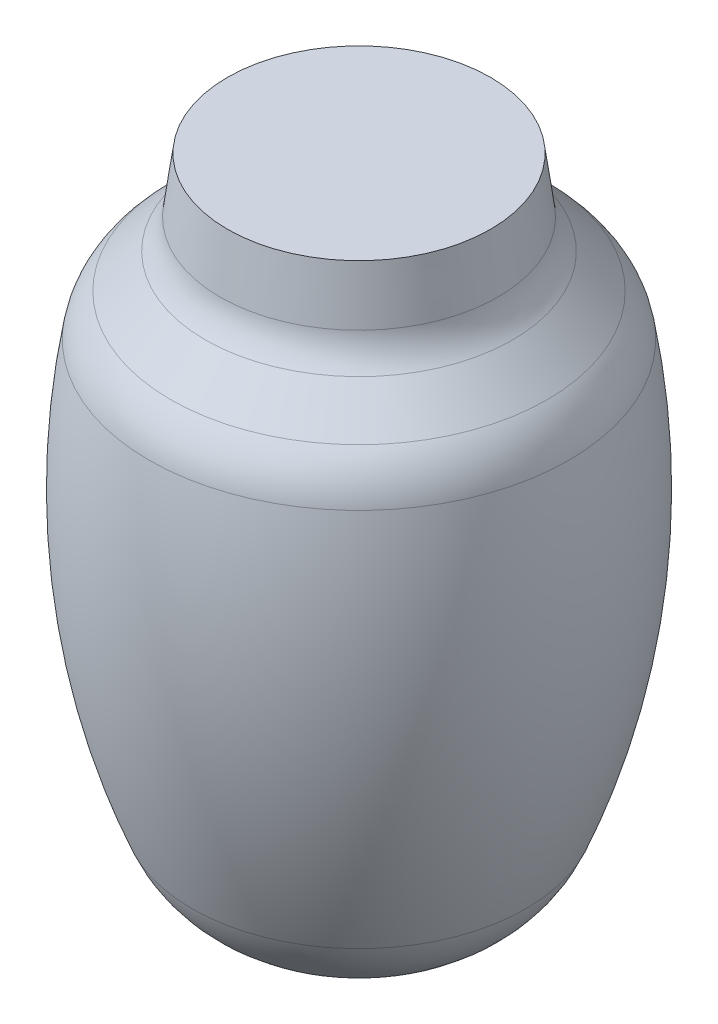
ISO-10303-21;
HEADER;
FILE_DESCRIPTION(('STEP AP214'),'2;1');
FILE_NAME('part.step','',(''),(''),'','','');
FILE_SCHEMA(('AUTOMOTIVE_DESIGN { 1 0 10303 214 1 1 1 1 }'));
ENDSEC;
DATA;
#1=APPLICATION_CONTEXT('core data for automotive mechanical design processes');
#2=APPLICATION_PROTOCOL_DEFINITION('international standard','automotive_design',2000,#1);
#3=PRODUCT_CONTEXT('',#1,'mechanical');
#4=PRODUCT('Part','Part','',(#3));
#5=PRODUCT_RELATED_PRODUCT_CATEGORY('part','',(#4));
#6=PRODUCT_DEFINITION_FORMATION('','',#4);
#7=PRODUCT_DEFINITION_CONTEXT('part definition',#1,'design');
#8=PRODUCT_DEFINITION('design','',#6,#7);
#9=PRODUCT_DEFINITION_SHAPE('','',#8);
#10=(LENGTH_UNIT() NAMED_UNIT(*) SI_UNIT(.MILLI.,.METRE.));
#11=(NAMED_UNIT(*) PLANE_ANGLE_UNIT() SI_UNIT($,.RADIAN.));
#12=(NAMED_UNIT(*) SI_UNIT($,.STERADIAN.) SOLID_ANGLE_UNIT());
#13=UNCERTAINTY_MEASURE_WITH_UNIT(LENGTH_MEASURE(1.E-05),#10,'distance_accuracy_value','');
#14=(GEOMETRIC_REPRESENTATION_CONTEXT(3) GLOBAL_UNCERTAINTY_ASSIGNED_CONTEXT((#13)) GLOBAL_UNIT_ASSIGNED_CONTEXT((#10,
#11,#12)) REPRESENTATION_CONTEXT('',''));
#15=CARTESIAN_POINT('',(0.,0.,0.));
#16=DIRECTION('',(0.,0.,1.));
#17=DIRECTION('',(1.,0.,0.));
#18=AXIS2_PLACEMENT_3D('',#15,#16,#17);
#19=CARTESIAN_POINT('',(481.719516665604,303.299031760844,0.));
#20=DIRECTION('',(0.,1.,0.));
#21=DIRECTION('',(0.,0.,1.));
#22=AXIS2_PLACEMENT_3D('',#19,#20,#21);
#23=DEGENERATE_TOROIDAL_SURFACE('',#22,130.605556352049,184.772032849957,.F.);
#24=CARTESIAN_POINT('',(481.719516665604,335.020947926108,0.));
#25=DIRECTION('',(0.,1.,0.));
#26=DIRECTION('',(0.,0.,1.));
#27=AXIS2_PLACEMENT_3D('',#24,#25,#26);
#28=CIRCLE('',#27,51.4230791927731);
#29=CARTESIAN_POINT('',(481.719516665604,335.020947926108,51.4230791927731));
#30=VERTEX_POINT('',#29);
#31=EDGE_CURVE('E54',#30,#30,#28,.T.);
#32=ORIENTED_EDGE('',*,*,#31,.F.);
#33=EDGE_LOOP('',(#32));
#34=FACE_BOUND('',#33,.T.);
#35=CARTESIAN_POINT('',(481.719516665604,234.587608086372,0.));
#36=DIRECTION('',(0.,1.,0.));
#37=DIRECTION('',(0.,0.,1.));
#38=AXIS2_PLACEMENT_3D('',#35,#36,#37);
#39=CIRCLE('',#38,40.9154172346615);
#40=CARTESIAN_POINT('',(481.719516665604,234.587608086372,40.9154172346615));
#41=VERTEX_POINT('',#40);
#42=EDGE_CURVE('E10',#41,#41,#39,.T.);
#43=ORIENTED_EDGE('',*,*,#42,.T.);
#44=EDGE_LOOP('',(#43));
#45=FACE_BOUND('',#44,.T.);
#46=ADVANCED_FACE('F29',(#34,#45),#23,.F.);
#47=CARTESIAN_POINT('',(481.719516665604,246.394523169869,0.));
#48=DIRECTION('',(0.,1.,0.));
#49=DIRECTION('',(0.,0.,1.));
#50=AXIS2_PLACEMENT_3D('',#47,#48,#49);
#51=DEGENERATE_TOROIDAL_SURFACE('',#50,11.4423913260259,31.75,.T.);
#52=ORIENTED_EDGE('',*,*,#42,.F.);
#53=EDGE_LOOP('',(#52));
#54=FACE_BOUND('',#53,.T.);
#55=CARTESIAN_POINT('',(481.719516665604,214.644523169869,0.));
#56=DIRECTION('',(0.,1.,0.));
#57=DIRECTION('',(0.,0.,1.));
#58=AXIS2_PLACEMENT_3D('',#55,#56,#57);
#59=CIRCLE('',#58,11.4423913260259);
#60=CARTESIAN_POINT('',(481.719516665604,214.644523169869,11.4423913260259));
#61=VERTEX_POINT('',#60);
#62=EDGE_CURVE('E35',#61,#61,#59,.T.);
#63=ORIENTED_EDGE('',*,*,#62,.T.);
#64=EDGE_LOOP('',(#63));
#65=FACE_BOUND('',#64,.T.);
#66=ADVANCED_FACE('F61',(#54,#65),#51,.T.);
#67=CARTESIAN_POINT('',(493.16190799163,214.644523169869,0.));
#68=DIRECTION('',(0.,1.,0.));
#69=DIRECTION('',(0.,0.,1.));
#70=AXIS2_PLACEMENT_3D('',#67,#68,#69);
#71=PLANE('',#70);
#72=ORIENTED_EDGE('',*,*,#62,.F.);
#73=EDGE_LOOP('',(#72));
#74=FACE_BOUND('',#73,.T.);
#75=ADVANCED_FACE('F65',(#74),#71,.F.);
#76=CARTESIAN_POINT('',(513.963655089514,374.45623267277,0.));
#77=DIRECTION('',(0.,-1.,0.));
#78=DIRECTION('',(0.,0.,-1.));
#79=AXIS2_PLACEMENT_3D('',#76,#77,#78);
#80=PLANE('',#79);
#81=CARTESIAN_POINT('',(481.719516665604,374.45623267277,0.));
#82=DIRECTION('',(0.,1.,0.));
#83=DIRECTION('',(0.,0.,1.));
#84=AXIS2_PLACEMENT_3D('',#81,#82,#83);
#85=CIRCLE('',#84,32.2441384239096);
#86=CARTESIAN_POINT('',(481.719516665604,374.45623267277,32.2441384239096));
#87=VERTEX_POINT('',#86);
#88=EDGE_CURVE('E39',#87,#87,#85,.T.);
#89=ORIENTED_EDGE('',*,*,#88,.T.);
#90=EDGE_LOOP('',(#89));
#91=FACE_BOUND('',#90,.T.);
#92=ADVANCED_FACE('F70',(#91),#80,.F.);
#93=CARTESIAN_POINT('',(481.719516665604,360.972346165505,0.));
#94=DIRECTION('',(0.,-1.,0.));
#95=DIRECTION('',(0.,0.,-1.));
#96=AXIS2_PLACEMENT_3D('',#93,#94,#95);
#97=CONICAL_SURFACE('',#96,34.0565983585995,0.133615853739486);
#98=ORIENTED_EDGE('',*,*,#88,.F.);
#99=EDGE_LOOP('',(#98));
#100=FACE_BOUND('',#99,.T.);
#101=CARTESIAN_POINT('',(481.719516665604,360.972346165505,0.));
#102=DIRECTION('',(0.,1.,0.));
#103=DIRECTION('',(0.,0.,1.));
#104=AXIS2_PLACEMENT_3D('',#101,#102,#103);
#105=CIRCLE('',#104,34.0565983585995);
#106=CARTESIAN_POINT('',(481.719516665604,360.972346165505,34.0565983585995));
#107=VERTEX_POINT('',#106);
#108=EDGE_CURVE('E43',#107,#107,#105,.T.);
#109=ORIENTED_EDGE('',*,*,#108,.T.);
#110=EDGE_LOOP('',(#109));
#111=FACE_BOUND('',#110,.T.);
#112=ADVANCED_FACE('F76',(#100,#111),#97,.T.);
#113=CARTESIAN_POINT('',(481.719516665604,362.664222768347,0.));
#114=DIRECTION('',(0.,1.,0.));
#115=DIRECTION('',(0.,0.,1.));
#116=AXIS2_PLACEMENT_3D('',#113,#114,#115);
#117=TOROIDAL_SURFACE('',#116,46.6433991261002,12.6999999999999);
#118=ORIENTED_EDGE('',*,*,#108,.F.);
#119=EDGE_LOOP('',(#118));
#120=FACE_BOUND('',#119,.T.);
#121=CARTESIAN_POINT('',(481.719516665604,353.683966647278,0.));
#122=DIRECTION('',(0.,1.,0.));
#123=DIRECTION('',(0.,0.,1.));
#124=AXIS2_PLACEMENT_3D('',#121,#122,#123);
#125=CIRCLE('',#124,37.6631430050312);
#126=CARTESIAN_POINT('',(481.719516665604,353.683966647278,37.6631430050312));
#127=VERTEX_POINT('',#126);
#128=EDGE_CURVE('E48',#127,#127,#125,.T.);
#129=ORIENTED_EDGE('',*,*,#128,.T.);
#130=EDGE_LOOP('',(#129));
#131=FACE_BOUND('',#130,.T.);
#132=ADVANCED_FACE('F80',(#120,#131),#117,.F.);
#133=CARTESIAN_POINT('',(481.719516665604,345.220801965095,0.));
#134=DIRECTION('',(0.,-1.,0.));
#135=DIRECTION('',(0.,0.,-1.));
#136=AXIS2_PLACEMENT_3D('',#133,#134,#135);
#137=CONICAL_SURFACE('',#136,46.1263076872133,0.785398163397435);
#138=ORIENTED_EDGE('',*,*,#128,.F.);
#139=EDGE_LOOP('',(#138));
#140=FACE_BOUND('',#139,.T.);
#141=CARTESIAN_POINT('',(481.719516665604,345.220801965095,0.));
#142=DIRECTION('',(0.,1.,0.));
#143=DIRECTION('',(0.,0.,1.));
#144=AXIS2_PLACEMENT_3D('',#141,#142,#143);
#145=CIRCLE('',#144,46.1263076872133);
#146=CARTESIAN_POINT('',(481.719516665604,345.220801965095,46.1263076872133));
#147=VERTEX_POINT('',#146);
#148=EDGE_CURVE('E51',#147,#147,#145,.T.);
#149=ORIENTED_EDGE('',*,*,#148,.T.);
#150=EDGE_LOOP('',(#149));
#151=FACE_BOUND('',#150,.T.);
#152=ADVANCED_FACE('F84',(#140,#151),#137,.T.);
#153=CARTESIAN_POINT('',(481.719516665604,331.750417783491,0.));
#154=DIRECTION('',(0.,1.,0.));
#155=DIRECTION('',(0.,0.,1.));
#156=AXIS2_PLACEMENT_3D('',#153,#154,#155);
#157=TOROIDAL_SURFACE('',#156,32.6559235056095,19.05);
#158=ORIENTED_EDGE('',*,*,#148,.F.);
#159=EDGE_LOOP('',(#158));
#160=FACE_BOUND('',#159,.T.);
#161=ORIENTED_EDGE('',*,*,#31,.T.);
#162=EDGE_LOOP('',(#161));
#163=FACE_BOUND('',#162,.T.);
#164=ADVANCED_FACE('F58',(#160,#163),#157,.T.);
#165=CLOSED_SHELL('',(#46,#66,#75,#92,#112,#132,#152,#164));
#166=MANIFOLD_SOLID_BREP('B2',#165);
#167=ADVANCED_BREP_SHAPE_REPRESENTATION('',(#18,#166),#14);
#168=SHAPE_DEFINITION_REPRESENTATION(#9,#167);
ENDSEC;
END-ISO-10303-21;
